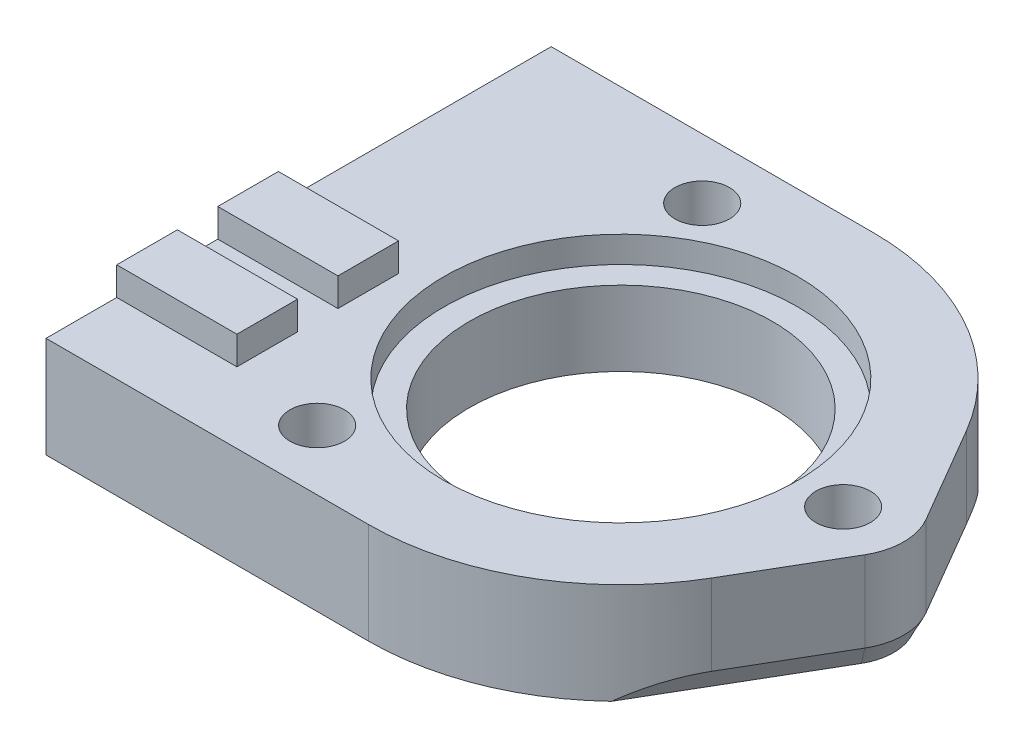
ISO-10303-21;
HEADER;
FILE_DESCRIPTION(('STEP AP214'),'2;1');
FILE_NAME('part.step','',(''),(''),'','','');
FILE_SCHEMA(('AUTOMOTIVE_DESIGN { 1 0 10303 214 1 1 1 1 }'));
ENDSEC;
DATA;
#1=APPLICATION_CONTEXT('core data for automotive mechanical design processes');
#2=APPLICATION_PROTOCOL_DEFINITION('international standard','automotive_design',2000,#1);
#3=PRODUCT_CONTEXT('',#1,'mechanical');
#4=PRODUCT('Part','Part','',(#3));
#5=PRODUCT_RELATED_PRODUCT_CATEGORY('part','',(#4));
#6=PRODUCT_DEFINITION_FORMATION('','',#4);
#7=PRODUCT_DEFINITION_CONTEXT('part definition',#1,'design');
#8=PRODUCT_DEFINITION('design','',#6,#7);
#9=PRODUCT_DEFINITION_SHAPE('','',#8);
#10=(LENGTH_UNIT() NAMED_UNIT(*) SI_UNIT(.MILLI.,.METRE.));
#11=(NAMED_UNIT(*) PLANE_ANGLE_UNIT() SI_UNIT($,.RADIAN.));
#12=(NAMED_UNIT(*) SI_UNIT($,.STERADIAN.) SOLID_ANGLE_UNIT());
#13=UNCERTAINTY_MEASURE_WITH_UNIT(LENGTH_MEASURE(1.E-05),#10,'distance_accuracy_value','');
#14=(GEOMETRIC_REPRESENTATION_CONTEXT(3) GLOBAL_UNCERTAINTY_ASSIGNED_CONTEXT((#13)) GLOBAL_UNIT_ASSIGNED_CONTEXT((#10,
#11,#12)) REPRESENTATION_CONTEXT('',''));
#15=CARTESIAN_POINT('',(0.,0.,0.));
#16=DIRECTION('',(0.,0.,1.));
#17=DIRECTION('',(1.,0.,0.));
#18=AXIS2_PLACEMENT_3D('',#15,#16,#17);
#19=CARTESIAN_POINT('',(-5.,6.4,9.));
#20=DIRECTION('',(0.,0.,-1.));
#21=DIRECTION('',(-1.,0.,0.));
#22=AXIS2_PLACEMENT_3D('',#19,#20,#21);
#23=PLANE('',#22);
#24=DIRECTION('',(0.,1.,0.));
#25=VECTOR('',#24,1.);
#26=CARTESIAN_POINT('',(29.0526284066724,6.4,9.));
#27=LINE('',#26,#25);
#28=CARTESIAN_POINT('',(29.0526284066724,5.,9.));
#29=VERTEX_POINT('',#28);
#30=CARTESIAN_POINT('',(29.0526284066724,6.4,9.));
#31=VERTEX_POINT('',#30);
#32=EDGE_CURVE('E56',#29,#31,#27,.T.);
#33=ORIENTED_EDGE('',*,*,#32,.F.);
#34=DIRECTION('',(1.,0.,0.));
#35=VECTOR('',#34,1.);
#36=CARTESIAN_POINT('',(-5.,5.,9.));
#37=LINE('',#36,#35);
#38=CARTESIAN_POINT('',(35.,5.,9.));
#39=VERTEX_POINT('',#38);
#40=EDGE_CURVE('E266',#29,#39,#37,.T.);
#41=ORIENTED_EDGE('',*,*,#40,.T.);
#42=DIRECTION('',(0.,-1.,0.));
#43=VECTOR('',#42,1.);
#44=CARTESIAN_POINT('',(35.,6.4,9.));
#45=LINE('',#44,#43);
#46=CARTESIAN_POINT('',(35.,6.4,9.));
#47=VERTEX_POINT('',#46);
#48=EDGE_CURVE('E275',#47,#39,#45,.T.);
#49=ORIENTED_EDGE('',*,*,#48,.F.);
#50=DIRECTION('',(1.,0.,0.));
#51=VECTOR('',#50,1.);
#52=CARTESIAN_POINT('',(-5.,6.4,9.));
#53=LINE('',#52,#51);
#54=EDGE_CURVE('E269',#31,#47,#53,.T.);
#55=ORIENTED_EDGE('',*,*,#54,.F.);
#56=EDGE_LOOP('',(#33,#41,#49,#55));
#57=FACE_BOUND('',#56,.T.);
#58=ADVANCED_FACE('F41',(#57),#23,.F.);
#59=CARTESIAN_POINT('',(-5.,6.4,1.));
#60=DIRECTION('',(0.,0.,1.));
#61=DIRECTION('',(1.,0.,0.));
#62=AXIS2_PLACEMENT_3D('',#59,#60,#61);
#63=PLANE('',#62);
#64=DIRECTION('',(0.,-1.,0.));
#65=VECTOR('',#64,1.);
#66=CARTESIAN_POINT('',(29.0526284066724,6.4,1.));
#67=LINE('',#66,#65);
#68=CARTESIAN_POINT('',(29.0526284066724,6.4,1.));
#69=VERTEX_POINT('',#68);
#70=CARTESIAN_POINT('',(29.0526284066724,5.,1.));
#71=VERTEX_POINT('',#70);
#72=EDGE_CURVE('E188',#69,#71,#67,.T.);
#73=ORIENTED_EDGE('',*,*,#72,.F.);
#74=DIRECTION('',(-1.,0.,0.));
#75=VECTOR('',#74,1.);
#76=CARTESIAN_POINT('',(-5.,6.4,1.));
#77=LINE('',#76,#75);
#78=CARTESIAN_POINT('',(35.,6.4,1.));
#79=VERTEX_POINT('',#78);
#80=EDGE_CURVE('E286',#79,#69,#77,.T.);
#81=ORIENTED_EDGE('',*,*,#80,.F.);
#82=DIRECTION('',(0.,-1.,0.));
#83=VECTOR('',#82,1.);
#84=CARTESIAN_POINT('',(35.,6.4,1.));
#85=LINE('',#84,#83);
#86=CARTESIAN_POINT('',(35.,5.,1.));
#87=VERTEX_POINT('',#86);
#88=EDGE_CURVE('E306',#79,#87,#85,.T.);
#89=ORIENTED_EDGE('',*,*,#88,.T.);
#90=DIRECTION('',(-1.,0.,0.));
#91=VECTOR('',#90,1.);
#92=CARTESIAN_POINT('',(-5.,5.,1.));
#93=LINE('',#92,#91);
#94=EDGE_CURVE('E298',#87,#71,#93,.T.);
#95=ORIENTED_EDGE('',*,*,#94,.T.);
#96=EDGE_LOOP('',(#73,#81,#89,#95));
#97=FACE_BOUND('',#96,.T.);
#98=ADVANCED_FACE('F423',(#97),#63,.F.);
#99=CARTESIAN_POINT('',(45.,5.,0.));
#100=DIRECTION('',(0.,1.,0.));
#101=DIRECTION('',(0.,0.,1.));
#102=AXIS2_PLACEMENT_3D('',#99,#100,#101);
#103=PLANE('',#102);
#104=CARTESIAN_POINT('',(56.,5.,0.));
#105=DIRECTION('',(0.,1.,0.));
#106=DIRECTION('',(0.,0.,1.));
#107=AXIS2_PLACEMENT_3D('',#104,#105,#106);
#108=CIRCLE('',#107,1.35);
#109=CARTESIAN_POINT('',(56.,5.,1.35));
#110=VERTEX_POINT('',#109);
#111=EDGE_CURVE('E310',#110,#110,#108,.T.);
#112=ORIENTED_EDGE('',*,*,#111,.F.);
#113=EDGE_LOOP('',(#112));
#114=FACE_BOUND('',#113,.T.);
#115=CARTESIAN_POINT('',(39.5,5.,9.52627944162882));
#116=DIRECTION('',(0.,1.,0.));
#117=DIRECTION('',(0.,0.,1.));
#118=AXIS2_PLACEMENT_3D('',#115,#116,#117);
#119=CIRCLE('',#118,1.35000000000001);
#120=CARTESIAN_POINT('',(39.5,5.,10.8762794416288));
#121=VERTEX_POINT('',#120);
#122=EDGE_CURVE('E319',#121,#121,#119,.T.);
#123=ORIENTED_EDGE('',*,*,#122,.F.);
#124=EDGE_LOOP('',(#123));
#125=FACE_BOUND('',#124,.T.);
#126=CARTESIAN_POINT('',(39.5,5.,-9.52627944162882));
#127=DIRECTION('',(0.,1.,0.));
#128=DIRECTION('',(0.,0.,1.));
#129=AXIS2_PLACEMENT_3D('',#126,#127,#128);
#130=CIRCLE('',#129,1.35000000000001);
#131=CARTESIAN_POINT('',(39.5,5.,-8.17627944162881));
#132=VERTEX_POINT('',#131);
#133=EDGE_CURVE('E309',#132,#132,#130,.T.);
#134=ORIENTED_EDGE('',*,*,#133,.F.);
#135=EDGE_LOOP('',(#134));
#136=FACE_BOUND('',#135,.T.);
#137=CARTESIAN_POINT('',(45.,5.,0.));
#138=DIRECTION('',(0.,1.,0.));
#139=DIRECTION('',(0.,0.,1.));
#140=AXIS2_PLACEMENT_3D('',#137,#138,#139);
#141=CIRCLE('',#140,8.75);
#142=CARTESIAN_POINT('',(45.,5.,8.75));
#143=VERTEX_POINT('',#142);
#144=EDGE_CURVE('E318',#143,#143,#141,.T.);
#145=ORIENTED_EDGE('',*,*,#144,.F.);
#146=EDGE_LOOP('',(#145));
#147=FACE_BOUND('',#146,.T.);
#148=DIRECTION('',(-1.,0.,0.));
#149=VECTOR('',#148,1.);
#150=CARTESIAN_POINT('',(45.,5.,-12.5));
#151=LINE('',#150,#149);
#152=CARTESIAN_POINT('',(45.,5.,-12.5));
#153=VERTEX_POINT('',#152);
#154=CARTESIAN_POINT('',(29.0526284066724,5.,-12.5));
#155=VERTEX_POINT('',#154);
#156=EDGE_CURVE('E370',#153,#155,#151,.T.);
#157=ORIENTED_EDGE('',*,*,#156,.T.);
#158=DIRECTION('',(0.,0.,1.));
#159=VECTOR('',#158,1.);
#160=CARTESIAN_POINT('',(29.0526284066724,5.,0.));
#161=LINE('',#160,#159);
#162=EDGE_CURVE('E394',#155,#71,#161,.T.);
#163=ORIENTED_EDGE('',*,*,#162,.T.);
#164=ORIENTED_EDGE('',*,*,#94,.F.);
#165=DIRECTION('',(0.,0.,-1.));
#166=VECTOR('',#165,1.);
#167=CARTESIAN_POINT('',(35.,5.,4.));
#168=LINE('',#167,#166);
#169=CARTESIAN_POINT('',(35.,5.,4.));
#170=VERTEX_POINT('',#169);
#171=EDGE_CURVE('E281',#170,#87,#168,.T.);
#172=ORIENTED_EDGE('',*,*,#171,.F.);
#173=DIRECTION('',(1.,0.,0.));
#174=VECTOR('',#173,1.);
#175=CARTESIAN_POINT('',(-5.,5.,4.));
#176=LINE('',#175,#174);
#177=CARTESIAN_POINT('',(29.0526284066724,5.,4.));
#178=VERTEX_POINT('',#177);
#179=EDGE_CURVE('E287',#178,#170,#176,.T.);
#180=ORIENTED_EDGE('',*,*,#179,.F.);
#181=CARTESIAN_POINT('',(29.0526284066724,5.,6.));
#182=VERTEX_POINT('',#181);
#183=EDGE_CURVE('E719',#178,#182,#161,.T.);
#184=ORIENTED_EDGE('',*,*,#183,.T.);
#185=DIRECTION('',(-1.,0.,0.));
#186=VECTOR('',#185,1.);
#187=CARTESIAN_POINT('',(-5.,5.,6.));
#188=LINE('',#187,#186);
#189=CARTESIAN_POINT('',(35.,5.,6.));
#190=VERTEX_POINT('',#189);
#191=EDGE_CURVE('E256',#190,#182,#188,.T.);
#192=ORIENTED_EDGE('',*,*,#191,.F.);
#193=DIRECTION('',(0.,0.,-1.));
#194=VECTOR('',#193,1.);
#195=CARTESIAN_POINT('',(35.,5.,9.));
#196=LINE('',#195,#194);
#197=EDGE_CURVE('E247',#39,#190,#196,.T.);
#198=ORIENTED_EDGE('',*,*,#197,.F.);
#199=ORIENTED_EDGE('',*,*,#40,.F.);
#200=CARTESIAN_POINT('',(29.0526284066724,5.,12.5));
#201=VERTEX_POINT('',#200);
#202=EDGE_CURVE('E713',#29,#201,#161,.T.);
#203=ORIENTED_EDGE('',*,*,#202,.T.);
#204=DIRECTION('',(1.,0.,0.));
#205=VECTOR('',#204,1.);
#206=CARTESIAN_POINT('',(45.,5.,12.5));
#207=LINE('',#206,#205);
#208=CARTESIAN_POINT('',(45.,5.,12.5));
#209=VERTEX_POINT('',#208);
#210=EDGE_CURVE('E186',#201,#209,#207,.T.);
#211=ORIENTED_EDGE('',*,*,#210,.T.);
#212=CARTESIAN_POINT('',(45.,5.,0.));
#213=DIRECTION('',(0.,1.,0.));
#214=DIRECTION('',(0.,0.,1.));
#215=AXIS2_PLACEMENT_3D('',#212,#213,#214);
#216=CIRCLE('',#215,12.5);
#217=CARTESIAN_POINT('',(55.7954545454545,5.,6.30144119682353));
#218=VERTEX_POINT('',#217);
#219=EDGE_CURVE('E201',#209,#218,#216,.T.);
#220=ORIENTED_EDGE('',*,*,#219,.T.);
#221=DIRECTION('',(0.504115295745884,0.,-0.863636363636363));
#222=VECTOR('',#221,1.);
#223=CARTESIAN_POINT('',(55.7954545454545,5.,6.30144119682353));
#224=LINE('',#223,#222);
#225=CARTESIAN_POINT('',(58.5909090909091,5.,1.51234588723765));
#226=VERTEX_POINT('',#225);
#227=EDGE_CURVE('E351',#218,#226,#224,.T.);
#228=ORIENTED_EDGE('',*,*,#227,.T.);
#229=CARTESIAN_POINT('',(56.0000000000001,5.,0.));
#230=DIRECTION('',(0.,1.,0.));
#231=DIRECTION('',(0.,0.,1.));
#232=AXIS2_PLACEMENT_3D('',#229,#230,#231);
#233=CIRCLE('',#232,2.99999999999995);
#234=CARTESIAN_POINT('',(58.5909090909091,5.,-1.51234588723765));
#235=VERTEX_POINT('',#234);
#236=EDGE_CURVE('E347',#226,#235,#233,.T.);
#237=ORIENTED_EDGE('',*,*,#236,.T.);
#238=DIRECTION('',(-0.504115295745884,0.,-0.863636363636363));
#239=VECTOR('',#238,1.);
#240=CARTESIAN_POINT('',(58.5909090909091,5.,-1.51234588723765));
#241=LINE('',#240,#239);
#242=CARTESIAN_POINT('',(55.7954545454545,5.,-6.30144119682353));
#243=VERTEX_POINT('',#242);
#244=EDGE_CURVE('E343',#235,#243,#241,.T.);
#245=ORIENTED_EDGE('',*,*,#244,.T.);
#246=EDGE_CURVE('E196',#243,#153,#216,.T.);
#247=ORIENTED_EDGE('',*,*,#246,.T.);
#248=EDGE_LOOP('',(#157,#163,#164,#172,#180,#184,#192,#198,#199,#203,#211,#220,#228,#237,#245,#247));
#249=FACE_BOUND('',#248,.T.);
#250=ADVANCED_FACE('F392',(#114,#125,#136,#147,#249),#103,.T.);
#251=CARTESIAN_POINT('',(45.,5.,-12.5));
#252=DIRECTION('',(0.,0.,1.));
#253=DIRECTION('',(1.,0.,0.));
#254=AXIS2_PLACEMENT_3D('',#251,#252,#253);
#255=PLANE('',#254);
#256=DIRECTION('',(0.,-1.,0.));
#257=VECTOR('',#256,1.);
#258=CARTESIAN_POINT('',(29.0526284066724,5.,-12.5));
#259=LINE('',#258,#257);
#260=CARTESIAN_POINT('',(29.0526284066724,0.,-12.5));
#261=VERTEX_POINT('',#260);
#262=EDGE_CURVE('E172',#155,#261,#259,.T.);
#263=ORIENTED_EDGE('',*,*,#262,.F.);
#264=ORIENTED_EDGE('',*,*,#156,.F.);
#265=DIRECTION('',(0.,-1.,0.));
#266=VECTOR('',#265,1.);
#267=CARTESIAN_POINT('',(45.,5.,-12.5));
#268=LINE('',#267,#266);
#269=CARTESIAN_POINT('',(45.,0.,-12.5));
#270=VERTEX_POINT('',#269);
#271=EDGE_CURVE('E210',#153,#270,#268,.T.);
#272=ORIENTED_EDGE('',*,*,#271,.T.);
#273=DIRECTION('',(-1.,0.,0.));
#274=VECTOR('',#273,1.);
#275=CARTESIAN_POINT('',(45.,0.,-12.5));
#276=LINE('',#275,#274);
#277=EDGE_CURVE('E197',#270,#261,#276,.T.);
#278=ORIENTED_EDGE('',*,*,#277,.T.);
#279=EDGE_LOOP('',(#263,#264,#272,#278));
#280=FACE_BOUND('',#279,.T.);
#281=ADVANCED_FACE('F389',(#280),#255,.F.);
#282=CARTESIAN_POINT('',(45.,5.,12.5));
#283=DIRECTION('',(0.,0.,-1.));
#284=DIRECTION('',(-1.,0.,0.));
#285=AXIS2_PLACEMENT_3D('',#282,#283,#284);
#286=PLANE('',#285);
#287=DIRECTION('',(0.,1.,0.));
#288=VECTOR('',#287,1.);
#289=CARTESIAN_POINT('',(29.0526284066724,5.,12.5));
#290=LINE('',#289,#288);
#291=CARTESIAN_POINT('',(29.0526284066724,0.,12.5));
#292=VERTEX_POINT('',#291);
#293=EDGE_CURVE('E169',#292,#201,#290,.T.);
#294=ORIENTED_EDGE('',*,*,#293,.F.);
#295=DIRECTION('',(1.,0.,0.));
#296=VECTOR('',#295,1.);
#297=CARTESIAN_POINT('',(45.,0.,12.5));
#298=LINE('',#297,#296);
#299=CARTESIAN_POINT('',(45.,0.,12.5));
#300=VERTEX_POINT('',#299);
#301=EDGE_CURVE('E184',#292,#300,#298,.T.);
#302=ORIENTED_EDGE('',*,*,#301,.T.);
#303=DIRECTION('',(0.,-1.,0.));
#304=VECTOR('',#303,1.);
#305=CARTESIAN_POINT('',(45.,5.,12.5));
#306=LINE('',#305,#304);
#307=EDGE_CURVE('E207',#209,#300,#306,.T.);
#308=ORIENTED_EDGE('',*,*,#307,.F.);
#309=ORIENTED_EDGE('',*,*,#210,.F.);
#310=EDGE_LOOP('',(#294,#302,#308,#309));
#311=FACE_BOUND('',#310,.T.);
#312=ADVANCED_FACE('F182',(#311),#286,.F.);
#313=CARTESIAN_POINT('',(45.,0.,0.));
#314=DIRECTION('',(0.,1.,0.));
#315=DIRECTION('',(0.,0.,1.));
#316=AXIS2_PLACEMENT_3D('',#313,#314,#315);
#317=PLANE('',#316);
#318=CARTESIAN_POINT('',(45.,0.,0.));
#319=DIRECTION('',(0.,1.,0.));
#320=DIRECTION('',(0.,0.,1.));
#321=AXIS2_PLACEMENT_3D('',#318,#319,#320);
#322=CIRCLE('',#321,7.5);
#323=CARTESIAN_POINT('',(45.,0.,7.5));
#324=VERTEX_POINT('',#323);
#325=EDGE_CURVE('E219',#324,#324,#322,.F.);
#326=ORIENTED_EDGE('',*,*,#325,.F.);
#327=EDGE_LOOP('',(#326));
#328=FACE_BOUND('',#327,.T.);
#329=CARTESIAN_POINT('',(39.5,0.,-9.52627944162882));
#330=DIRECTION('',(0.,1.,0.));
#331=DIRECTION('',(0.,0.,1.));
#332=AXIS2_PLACEMENT_3D('',#329,#330,#331);
#333=CIRCLE('',#332,1.35000000000001);
#334=CARTESIAN_POINT('',(39.5,0.,-8.17627944162881));
#335=VERTEX_POINT('',#334);
#336=EDGE_CURVE('E323',#335,#335,#333,.F.);
#337=ORIENTED_EDGE('',*,*,#336,.F.);
#338=EDGE_LOOP('',(#337));
#339=FACE_BOUND('',#338,.T.);
#340=CARTESIAN_POINT('',(39.5,0.,9.52627944162882));
#341=DIRECTION('',(0.,1.,0.));
#342=DIRECTION('',(0.,0.,1.));
#343=AXIS2_PLACEMENT_3D('',#340,#341,#342);
#344=CIRCLE('',#343,1.35000000000001);
#345=CARTESIAN_POINT('',(39.5,0.,10.8762794416288));
#346=VERTEX_POINT('',#345);
#347=EDGE_CURVE('E314',#346,#346,#344,.F.);
#348=ORIENTED_EDGE('',*,*,#347,.F.);
#349=EDGE_LOOP('',(#348));
#350=FACE_BOUND('',#349,.T.);
#351=CARTESIAN_POINT('',(56.,0.,0.));
#352=DIRECTION('',(0.,1.,0.));
#353=DIRECTION('',(0.,0.,1.));
#354=AXIS2_PLACEMENT_3D('',#351,#352,#353);
#355=CIRCLE('',#354,1.35);
#356=CARTESIAN_POINT('',(56.,0.,1.35));
#357=VERTEX_POINT('',#356);
#358=EDGE_CURVE('E313',#357,#357,#355,.F.);
#359=ORIENTED_EDGE('',*,*,#358,.F.);
#360=EDGE_LOOP('',(#359));
#361=FACE_BOUND('',#360,.T.);
#362=DIRECTION('',(0.,0.,-1.));
#363=VECTOR('',#362,1.);
#364=CARTESIAN_POINT('',(29.0526284066724,0.,20.6622725443589));
#365=LINE('',#364,#363);
#366=EDGE_CURVE('E166',#292,#261,#365,.T.);
#367=ORIENTED_EDGE('',*,*,#366,.T.);
#368=ORIENTED_EDGE('',*,*,#277,.F.);
#369=CARTESIAN_POINT('',(45.,0.,0.));
#370=DIRECTION('',(0.,1.,0.));
#371=DIRECTION('',(0.,0.,1.));
#372=AXIS2_PLACEMENT_3D('',#369,#370,#371);
#373=CIRCLE('',#372,12.5);
#374=CARTESIAN_POINT('',(53.5992328285258,0.,-9.07211082167782));
#375=VERTEX_POINT('',#374);
#376=EDGE_CURVE('E346',#375,#270,#373,.T.);
#377=ORIENTED_EDGE('',*,*,#376,.F.);
#378=DIRECTION('',(0.504115295745884,0.,0.863636363636363));
#379=VECTOR('',#378,1.);
#380=CARTESIAN_POINT('',(55.3636363636364,0.,-6.04938354895061));
#381=LINE('',#380,#379);
#382=CARTESIAN_POINT('',(58.1590909090909,0.,-1.26028823936472));
#383=VERTEX_POINT('',#382);
#384=EDGE_CURVE('E226',#375,#383,#381,.T.);
#385=ORIENTED_EDGE('',*,*,#384,.T.);
#386=CARTESIAN_POINT('',(56.0000000000001,0.,0.));
#387=DIRECTION('',(0.,1.,0.));
#388=DIRECTION('',(0.,0.,1.));
#389=AXIS2_PLACEMENT_3D('',#386,#387,#388);
#390=CIRCLE('',#389,2.49999999999997);
#391=CARTESIAN_POINT('',(58.1590909090909,0.,1.26028823936472));
#392=VERTEX_POINT('',#391);
#393=EDGE_CURVE('E223',#383,#392,#390,.F.);
#394=ORIENTED_EDGE('',*,*,#393,.T.);
#395=DIRECTION('',(-0.504115295745884,0.,0.863636363636363));
#396=VECTOR('',#395,1.);
#397=CARTESIAN_POINT('',(55.3636363636364,0.,6.04938354895061));
#398=LINE('',#397,#396);
#399=CARTESIAN_POINT('',(53.5992328285258,0.,9.07211082167782));
#400=VERTEX_POINT('',#399);
#401=EDGE_CURVE('E229',#392,#400,#398,.T.);
#402=ORIENTED_EDGE('',*,*,#401,.T.);
#403=EDGE_CURVE('E194',#300,#400,#373,.T.);
#404=ORIENTED_EDGE('',*,*,#403,.F.);
#405=ORIENTED_EDGE('',*,*,#301,.F.);
#406=EDGE_LOOP('',(#367,#368,#377,#385,#394,#402,#404,#405));
#407=FACE_BOUND('',#406,.T.);
#408=ADVANCED_FACE('F192',(#328,#339,#350,#361,#407),#317,.F.);
#409=CARTESIAN_POINT('',(-5.,6.4,4.));
#410=DIRECTION('',(0.,0.,-1.));
#411=DIRECTION('',(-1.,0.,0.));
#412=AXIS2_PLACEMENT_3D('',#409,#410,#411);
#413=PLANE('',#412);
#414=DIRECTION('',(0.,1.,0.));
#415=VECTOR('',#414,1.);
#416=CARTESIAN_POINT('',(29.0526284066724,6.4,4.));
#417=LINE('',#416,#415);
#418=CARTESIAN_POINT('',(29.0526284066724,6.4,4.));
#419=VERTEX_POINT('',#418);
#420=EDGE_CURVE('E714',#178,#419,#417,.T.);
#421=ORIENTED_EDGE('',*,*,#420,.F.);
#422=ORIENTED_EDGE('',*,*,#179,.T.);
#423=DIRECTION('',(0.,-1.,0.));
#424=VECTOR('',#423,1.);
#425=CARTESIAN_POINT('',(35.,6.4,4.));
#426=LINE('',#425,#424);
#427=CARTESIAN_POINT('',(35.,6.4,4.));
#428=VERTEX_POINT('',#427);
#429=EDGE_CURVE('E294',#428,#170,#426,.T.);
#430=ORIENTED_EDGE('',*,*,#429,.F.);
#431=DIRECTION('',(1.,0.,0.));
#432=VECTOR('',#431,1.);
#433=CARTESIAN_POINT('',(-5.,6.4,4.));
#434=LINE('',#433,#432);
#435=EDGE_CURVE('E291',#419,#428,#434,.T.);
#436=ORIENTED_EDGE('',*,*,#435,.F.);
#437=EDGE_LOOP('',(#421,#422,#430,#436));
#438=FACE_BOUND('',#437,.T.);
#439=ADVANCED_FACE('F446',(#438),#413,.F.);
#440=CARTESIAN_POINT('',(0.,6.4,0.));
#441=DIRECTION('',(0.,-1.,0.));
#442=DIRECTION('',(0.,0.,-1.));
#443=AXIS2_PLACEMENT_3D('',#440,#441,#442);
#444=PLANE('',#443);
#445=DIRECTION('',(0.,0.,-1.));
#446=VECTOR('',#445,1.);
#447=CARTESIAN_POINT('',(29.0526284066724,6.4,0.));
#448=LINE('',#447,#446);
#449=EDGE_CURVE('E189',#419,#69,#448,.T.);
#450=ORIENTED_EDGE('',*,*,#449,.F.);
#451=ORIENTED_EDGE('',*,*,#435,.T.);
#452=DIRECTION('',(0.,0.,-1.));
#453=VECTOR('',#452,1.);
#454=CARTESIAN_POINT('',(35.,6.4,4.));
#455=LINE('',#454,#453);
#456=EDGE_CURVE('E282',#428,#79,#455,.T.);
#457=ORIENTED_EDGE('',*,*,#456,.T.);
#458=ORIENTED_EDGE('',*,*,#80,.T.);
#459=EDGE_LOOP('',(#450,#451,#457,#458));
#460=FACE_BOUND('',#459,.T.);
#461=ADVANCED_FACE('F438',(#460),#444,.F.);
#462=CARTESIAN_POINT('',(-5.,6.4,6.));
#463=DIRECTION('',(0.,0.,1.));
#464=DIRECTION('',(1.,0.,0.));
#465=AXIS2_PLACEMENT_3D('',#462,#463,#464);
#466=PLANE('',#465);
#467=DIRECTION('',(0.,-1.,0.));
#468=VECTOR('',#467,1.);
#469=CARTESIAN_POINT('',(29.0526284066724,6.4,6.));
#470=LINE('',#469,#468);
#471=CARTESIAN_POINT('',(29.0526284066724,6.4,6.));
#472=VERTEX_POINT('',#471);
#473=EDGE_CURVE('E178',#472,#182,#470,.T.);
#474=ORIENTED_EDGE('',*,*,#473,.F.);
#475=DIRECTION('',(-1.,0.,0.));
#476=VECTOR('',#475,1.);
#477=CARTESIAN_POINT('',(-5.,6.4,6.));
#478=LINE('',#477,#476);
#479=CARTESIAN_POINT('',(35.,6.4,6.));
#480=VERTEX_POINT('',#479);
#481=EDGE_CURVE('E699',#480,#472,#478,.T.);
#482=ORIENTED_EDGE('',*,*,#481,.F.);
#483=DIRECTION('',(0.,-1.,0.));
#484=VECTOR('',#483,1.);
#485=CARTESIAN_POINT('',(35.,6.4,6.));
#486=LINE('',#485,#484);
#487=EDGE_CURVE('E278',#480,#190,#486,.T.);
#488=ORIENTED_EDGE('',*,*,#487,.T.);
#489=ORIENTED_EDGE('',*,*,#191,.T.);
#490=EDGE_LOOP('',(#474,#482,#488,#489));
#491=FACE_BOUND('',#490,.T.);
#492=ADVANCED_FACE('F435',(#491),#466,.F.);
#493=CARTESIAN_POINT('',(0.,6.4,0.));
#494=DIRECTION('',(0.,-1.,0.));
#495=DIRECTION('',(0.,0.,-1.));
#496=AXIS2_PLACEMENT_3D('',#493,#494,#495);
#497=PLANE('',#496);
#498=DIRECTION('',(0.,0.,-1.));
#499=VECTOR('',#498,1.);
#500=CARTESIAN_POINT('',(29.0526284066724,6.4,0.));
#501=LINE('',#500,#499);
#502=EDGE_CURVE('E11',#31,#472,#501,.T.);
#503=ORIENTED_EDGE('',*,*,#502,.F.);
#504=ORIENTED_EDGE('',*,*,#54,.T.);
#505=DIRECTION('',(0.,0.,-1.));
#506=VECTOR('',#505,1.);
#507=CARTESIAN_POINT('',(35.,6.4,9.));
#508=LINE('',#507,#506);
#509=EDGE_CURVE('E274',#47,#480,#508,.T.);
#510=ORIENTED_EDGE('',*,*,#509,.T.);
#511=ORIENTED_EDGE('',*,*,#481,.T.);
#512=EDGE_LOOP('',(#503,#504,#510,#511));
#513=FACE_BOUND('',#512,.T.);
#514=ADVANCED_FACE('F433',(#513),#497,.F.);
#515=CARTESIAN_POINT('',(45.,-0.00100000000000013,0.));
#516=DIRECTION('',(0.,1.,0.));
#517=DIRECTION('',(0.,0.,1.));
#518=AXIS2_PLACEMENT_3D('',#515,#516,#517);
#519=CYLINDRICAL_SURFACE('',#518,7.5);
#520=ORIENTED_EDGE('',*,*,#325,.T.);
#521=EDGE_LOOP('',(#520));
#522=FACE_BOUND('',#521,.T.);
#523=CARTESIAN_POINT('',(45.,3.7,0.));
#524=DIRECTION('',(0.,1.,0.));
#525=DIRECTION('',(0.,0.,1.));
#526=AXIS2_PLACEMENT_3D('',#523,#524,#525);
#527=CIRCLE('',#526,7.5);
#528=CARTESIAN_POINT('',(45.,3.7,7.5));
#529=VERTEX_POINT('',#528);
#530=EDGE_CURVE('E215',#529,#529,#527,.F.);
#531=ORIENTED_EDGE('',*,*,#530,.F.);
#532=EDGE_LOOP('',(#531));
#533=FACE_BOUND('',#532,.T.);
#534=ADVANCED_FACE('F419',(#522,#533),#519,.F.);
#535=CARTESIAN_POINT('',(45.,5.,0.));
#536=DIRECTION('',(0.,-1.,0.));
#537=DIRECTION('',(0.,0.,-1.));
#538=AXIS2_PLACEMENT_3D('',#535,#536,#537);
#539=CYLINDRICAL_SURFACE('',#538,12.5);
#540=DIRECTION('',(0.,-1.,0.));
#541=VECTOR('',#540,1.);
#542=CARTESIAN_POINT('',(55.7954545454545,18.0039131109965,-6.30144119682353));
#543=LINE('',#542,#541);
#544=CARTESIAN_POINT('',(55.7954545454545,0.999999999999952,-6.30144119682353));
#545=VERTEX_POINT('',#544);
#546=EDGE_CURVE('E359',#243,#545,#543,.T.);
#547=ORIENTED_EDGE('',*,*,#546,.T.);
#548=CARTESIAN_POINT('',(45.,-23.9999999999998,0.));
#549=DIRECTION('',(-0.772459846772653,0.447213595499961,0.450894427914082));
#550=DIRECTION('',(-0.38622992338633,-0.894427190999914,0.225447213957043));
#551=AXIS2_PLACEMENT_3D('',#548,#549,#550);
#552=ELLIPSE('',#551,27.9508497187471,12.5);
#553=EDGE_CURVE('E237',#545,#375,#552,.T.);
#554=ORIENTED_EDGE('',*,*,#553,.T.);
#555=ORIENTED_EDGE('',*,*,#376,.T.);
#556=ORIENTED_EDGE('',*,*,#271,.F.);
#557=ORIENTED_EDGE('',*,*,#246,.F.);
#558=EDGE_LOOP('',(#547,#554,#555,#556,#557));
#559=FACE_BOUND('',#558,.T.);
#560=ADVANCED_FACE('F383',(#559),#539,.T.);
#561=ORIENTED_EDGE('',*,*,#403,.T.);
#562=CARTESIAN_POINT('',(45.,-23.9999999999998,0.));
#563=DIRECTION('',(-0.772459846772653,0.447213595499962,-0.450894427914082));
#564=DIRECTION('',(-0.38622992338633,-0.894427190999914,-0.225447213957043));
#565=AXIS2_PLACEMENT_3D('',#562,#563,#564);
#566=ELLIPSE('',#565,27.9508497187471,12.5);
#567=CARTESIAN_POINT('',(55.7954545454545,0.999999999999952,6.30144119682353));
#568=VERTEX_POINT('',#567);
#569=EDGE_CURVE('E232',#400,#568,#566,.T.);
#570=ORIENTED_EDGE('',*,*,#569,.T.);
#571=DIRECTION('',(0.,-1.,0.));
#572=VECTOR('',#571,1.);
#573=CARTESIAN_POINT('',(55.7954545454545,18.0039131109965,6.30144119682353));
#574=LINE('',#573,#572);
#575=EDGE_CURVE('E355',#218,#568,#574,.T.);
#576=ORIENTED_EDGE('',*,*,#575,.F.);
#577=ORIENTED_EDGE('',*,*,#219,.F.);
#578=ORIENTED_EDGE('',*,*,#307,.T.);
#579=EDGE_LOOP('',(#561,#570,#576,#577,#578));
#580=FACE_BOUND('',#579,.T.);
#581=ADVANCED_FACE('F410',(#580),#539,.T.);
#582=CARTESIAN_POINT('',(56.0000000000001,18.0039131109965,0.));
#583=DIRECTION('',(0.,-1.,0.));
#584=DIRECTION('',(0.,0.,-1.));
#585=AXIS2_PLACEMENT_3D('',#582,#583,#584);
#586=CYLINDRICAL_SURFACE('',#585,2.99999999999995);
#587=DIRECTION('',(0.,-1.,0.));
#588=VECTOR('',#587,1.);
#589=CARTESIAN_POINT('',(58.5909090909091,18.0039131109965,1.51234588723765));
#590=LINE('',#589,#588);
#591=CARTESIAN_POINT('',(58.5909090909091,0.999999999999952,1.51234588723765));
#592=VERTEX_POINT('',#591);
#593=EDGE_CURVE('E342',#226,#592,#590,.T.);
#594=ORIENTED_EDGE('',*,*,#593,.T.);
#595=CARTESIAN_POINT('',(56.0000000000001,0.999999999999952,0.));
#596=DIRECTION('',(0.,1.,0.));
#597=DIRECTION('',(0.,0.,1.));
#598=AXIS2_PLACEMENT_3D('',#595,#596,#597);
#599=CIRCLE('',#598,2.99999999999995);
#600=CARTESIAN_POINT('',(58.5909090909091,0.999999999999952,-1.51234588723765));
#601=VERTEX_POINT('',#600);
#602=EDGE_CURVE('E50',#592,#601,#599,.T.);
#603=ORIENTED_EDGE('',*,*,#602,.T.);
#604=DIRECTION('',(0.,-1.,0.));
#605=VECTOR('',#604,1.);
#606=CARTESIAN_POINT('',(58.5909090909091,18.0039131109965,-1.51234588723765));
#607=LINE('',#606,#605);
#608=EDGE_CURVE('E356',#235,#601,#607,.T.);
#609=ORIENTED_EDGE('',*,*,#608,.F.);
#610=ORIENTED_EDGE('',*,*,#236,.F.);
#611=EDGE_LOOP('',(#594,#603,#609,#610));
#612=FACE_BOUND('',#611,.T.);
#613=ADVANCED_FACE('F408',(#612),#586,.T.);
#614=CARTESIAN_POINT('',(58.5909090909091,18.0039131109965,-1.51234588723765));
#615=DIRECTION('',(-0.863636363636363,0.,0.504115295745884));
#616=DIRECTION('',(0.504115295745884,0.,0.863636363636363));
#617=AXIS2_PLACEMENT_3D('',#614,#615,#616);
#618=PLANE('',#617);
#619=ORIENTED_EDGE('',*,*,#608,.T.);
#620=DIRECTION('',(-0.504115295745884,0.,-0.863636363636363));
#621=VECTOR('',#620,1.);
#622=CARTESIAN_POINT('',(58.5909090909091,0.999999999999952,-1.51234588723765));
#623=LINE('',#622,#621);
#624=EDGE_CURVE('E64',#601,#545,#623,.T.);
#625=ORIENTED_EDGE('',*,*,#624,.T.);
#626=ORIENTED_EDGE('',*,*,#546,.F.);
#627=ORIENTED_EDGE('',*,*,#244,.F.);
#628=EDGE_LOOP('',(#619,#625,#626,#627));
#629=FACE_BOUND('',#628,.T.);
#630=ADVANCED_FACE('F417',(#629),#618,.F.);
#631=CARTESIAN_POINT('',(55.7954545454545,18.0039131109965,6.30144119682353));
#632=DIRECTION('',(-0.863636363636363,0.,-0.504115295745884));
#633=DIRECTION('',(-0.504115295745884,0.,0.863636363636363));
#634=AXIS2_PLACEMENT_3D('',#631,#632,#633);
#635=PLANE('',#634);
#636=ORIENTED_EDGE('',*,*,#575,.T.);
#637=DIRECTION('',(0.504115295745884,0.,-0.863636363636363));
#638=VECTOR('',#637,1.);
#639=CARTESIAN_POINT('',(55.7954545454545,0.999999999999952,6.30144119682353));
#640=LINE('',#639,#638);
#641=EDGE_CURVE('E214',#568,#592,#640,.T.);
#642=ORIENTED_EDGE('',*,*,#641,.T.);
#643=ORIENTED_EDGE('',*,*,#593,.F.);
#644=ORIENTED_EDGE('',*,*,#227,.F.);
#645=EDGE_LOOP('',(#636,#642,#643,#644));
#646=FACE_BOUND('',#645,.T.);
#647=ADVANCED_FACE('F405',(#646),#635,.F.);
#648=CARTESIAN_POINT('',(45.,3.7,0.));
#649=DIRECTION('',(0.,1.,0.));
#650=DIRECTION('',(0.,0.,1.));
#651=AXIS2_PLACEMENT_3D('',#648,#649,#650);
#652=PLANE('',#651);
#653=CARTESIAN_POINT('',(45.,3.7,0.));
#654=DIRECTION('',(0.,1.,0.));
#655=DIRECTION('',(0.,0.,1.));
#656=AXIS2_PLACEMENT_3D('',#653,#654,#655);
#657=CIRCLE('',#656,8.75);
#658=CARTESIAN_POINT('',(45.,3.7,8.75));
#659=VERTEX_POINT('',#658);
#660=EDGE_CURVE('E220',#659,#659,#657,.T.);
#661=ORIENTED_EDGE('',*,*,#660,.T.);
#662=EDGE_LOOP('',(#661));
#663=FACE_BOUND('',#662,.T.);
#664=ORIENTED_EDGE('',*,*,#530,.T.);
#665=EDGE_LOOP('',(#664));
#666=FACE_BOUND('',#665,.T.);
#667=ADVANCED_FACE('F467',(#663,#666),#652,.T.);
#668=CARTESIAN_POINT('',(45.,3.7,0.));
#669=DIRECTION('',(0.,1.,0.));
#670=DIRECTION('',(0.,0.,1.));
#671=AXIS2_PLACEMENT_3D('',#668,#669,#670);
#672=CYLINDRICAL_SURFACE('',#671,8.75);
#673=ORIENTED_EDGE('',*,*,#660,.F.);
#674=EDGE_LOOP('',(#673));
#675=FACE_BOUND('',#674,.T.);
#676=ORIENTED_EDGE('',*,*,#144,.T.);
#677=EDGE_LOOP('',(#676));
#678=FACE_BOUND('',#677,.T.);
#679=ADVANCED_FACE('F465',(#675,#678),#672,.F.);
#680=CARTESIAN_POINT('',(39.5,-0.00100000000000013,-9.52627944162882));
#681=DIRECTION('',(0.,1.,0.));
#682=DIRECTION('',(0.,0.,1.));
#683=AXIS2_PLACEMENT_3D('',#680,#681,#682);
#684=CYLINDRICAL_SURFACE('',#683,1.35000000000001);
#685=ORIENTED_EDGE('',*,*,#133,.T.);
#686=EDGE_LOOP('',(#685));
#687=FACE_BOUND('',#686,.T.);
#688=ORIENTED_EDGE('',*,*,#336,.T.);
#689=EDGE_LOOP('',(#688));
#690=FACE_BOUND('',#689,.T.);
#691=ADVANCED_FACE('F461',(#687,#690),#684,.F.);
#692=CARTESIAN_POINT('',(39.5,-0.00100000000000013,9.52627944162882));
#693=DIRECTION('',(0.,1.,0.));
#694=DIRECTION('',(0.,0.,1.));
#695=AXIS2_PLACEMENT_3D('',#692,#693,#694);
#696=CYLINDRICAL_SURFACE('',#695,1.35000000000001);
#697=ORIENTED_EDGE('',*,*,#122,.T.);
#698=EDGE_LOOP('',(#697));
#699=FACE_BOUND('',#698,.T.);
#700=ORIENTED_EDGE('',*,*,#347,.T.);
#701=EDGE_LOOP('',(#700));
#702=FACE_BOUND('',#701,.T.);
#703=ADVANCED_FACE('F457',(#699,#702),#696,.F.);
#704=CARTESIAN_POINT('',(56.,-0.00100000000000013,0.));
#705=DIRECTION('',(0.,1.,0.));
#706=DIRECTION('',(0.,0.,1.));
#707=AXIS2_PLACEMENT_3D('',#704,#705,#706);
#708=CYLINDRICAL_SURFACE('',#707,1.35);
#709=ORIENTED_EDGE('',*,*,#111,.T.);
#710=EDGE_LOOP('',(#709));
#711=FACE_BOUND('',#710,.T.);
#712=ORIENTED_EDGE('',*,*,#358,.T.);
#713=EDGE_LOOP('',(#712));
#714=FACE_BOUND('',#713,.T.);
#715=ADVANCED_FACE('F453',(#711,#714),#708,.F.);
#716=CARTESIAN_POINT('',(35.,6.4,4.));
#717=DIRECTION('',(-1.,0.,0.));
#718=DIRECTION('',(0.,0.,1.));
#719=AXIS2_PLACEMENT_3D('',#716,#717,#718);
#720=PLANE('',#719);
#721=ORIENTED_EDGE('',*,*,#171,.T.);
#722=ORIENTED_EDGE('',*,*,#88,.F.);
#723=ORIENTED_EDGE('',*,*,#456,.F.);
#724=ORIENTED_EDGE('',*,*,#429,.T.);
#725=EDGE_LOOP('',(#721,#722,#723,#724));
#726=FACE_BOUND('',#725,.T.);
#727=ADVANCED_FACE('F443',(#726),#720,.F.);
#728=CARTESIAN_POINT('',(35.,6.4,9.));
#729=DIRECTION('',(-1.,0.,0.));
#730=DIRECTION('',(0.,0.,1.));
#731=AXIS2_PLACEMENT_3D('',#728,#729,#730);
#732=PLANE('',#731);
#733=ORIENTED_EDGE('',*,*,#197,.T.);
#734=ORIENTED_EDGE('',*,*,#487,.F.);
#735=ORIENTED_EDGE('',*,*,#509,.F.);
#736=ORIENTED_EDGE('',*,*,#48,.T.);
#737=EDGE_LOOP('',(#733,#734,#735,#736));
#738=FACE_BOUND('',#737,.T.);
#739=ADVANCED_FACE('F440',(#738),#732,.F.);
#740=CARTESIAN_POINT('',(58.5909090909091,0.999999999999952,-1.51234588723765));
#741=DIRECTION('',(-0.772459846772653,0.447213595499961,0.450894427914082));
#742=DIRECTION('',(-0.504115295745884,0.,-0.863636363636363));
#743=AXIS2_PLACEMENT_3D('',#740,#741,#742);
#744=PLANE('',#743);
#745=ORIENTED_EDGE('',*,*,#553,.F.);
#746=ORIENTED_EDGE('',*,*,#624,.F.);
#747=DIRECTION('',(0.38622992338633,0.894427190999914,-0.225447213957043));
#748=VECTOR('',#747,1.);
#749=CARTESIAN_POINT('',(58.1590909090909,0.,-1.26028823936472));
#750=LINE('',#749,#748);
#751=EDGE_CURVE('E244',#383,#601,#750,.T.);
#752=ORIENTED_EDGE('',*,*,#751,.F.);
#753=ORIENTED_EDGE('',*,*,#384,.F.);
#754=EDGE_LOOP('',(#745,#746,#752,#753));
#755=FACE_BOUND('',#754,.T.);
#756=ADVANCED_FACE('F43',(#755),#744,.F.);
#757=CARTESIAN_POINT('',(56.0000000000001,0.999999999999952,0.));
#758=DIRECTION('',(0.,1.,0.));
#759=DIRECTION('',(0.,0.,1.));
#760=AXIS2_PLACEMENT_3D('',#757,#758,#759);
#761=CONICAL_SURFACE('',#760,2.99999999999995,0.463647609000807);
#762=ORIENTED_EDGE('',*,*,#751,.T.);
#763=ORIENTED_EDGE('',*,*,#602,.F.);
#764=DIRECTION('',(0.386229923386324,0.894427190999916,0.225447213957047));
#765=VECTOR('',#764,1.);
#766=CARTESIAN_POINT('',(58.1590909090909,0.,1.26028823936472));
#767=LINE('',#766,#765);
#768=EDGE_CURVE('E242',#392,#592,#767,.T.);
#769=ORIENTED_EDGE('',*,*,#768,.F.);
#770=ORIENTED_EDGE('',*,*,#393,.F.);
#771=EDGE_LOOP('',(#762,#763,#769,#770));
#772=FACE_BOUND('',#771,.T.);
#773=ADVANCED_FACE('F401',(#772),#761,.T.);
#774=CARTESIAN_POINT('',(55.7954545454545,0.999999999999952,6.30144119682353));
#775=DIRECTION('',(-0.772459846772653,0.447213595499962,-0.450894427914082));
#776=DIRECTION('',(0.504115295745884,0.,-0.863636363636363));
#777=AXIS2_PLACEMENT_3D('',#774,#775,#776);
#778=PLANE('',#777);
#779=ORIENTED_EDGE('',*,*,#569,.F.);
#780=ORIENTED_EDGE('',*,*,#401,.F.);
#781=ORIENTED_EDGE('',*,*,#768,.T.);
#782=ORIENTED_EDGE('',*,*,#641,.F.);
#783=EDGE_LOOP('',(#779,#780,#781,#782));
#784=FACE_BOUND('',#783,.T.);
#785=ADVANCED_FACE('F399',(#784),#778,.F.);
#786=CARTESIAN_POINT('',(29.0526284066724,111.833918488817,20.6622725443589));
#787=DIRECTION('',(-1.,0.,0.));
#788=DIRECTION('',(0.,0.,1.));
#789=AXIS2_PLACEMENT_3D('',#786,#787,#788);
#790=PLANE('',#789);
#791=ORIENTED_EDGE('',*,*,#262,.T.);
#792=ORIENTED_EDGE('',*,*,#366,.F.);
#793=ORIENTED_EDGE('',*,*,#293,.T.);
#794=ORIENTED_EDGE('',*,*,#202,.F.);
#795=ORIENTED_EDGE('',*,*,#32,.T.);
#796=ORIENTED_EDGE('',*,*,#502,.T.);
#797=ORIENTED_EDGE('',*,*,#473,.T.);
#798=ORIENTED_EDGE('',*,*,#183,.F.);
#799=ORIENTED_EDGE('',*,*,#420,.T.);
#800=ORIENTED_EDGE('',*,*,#449,.T.);
#801=ORIENTED_EDGE('',*,*,#72,.T.);
#802=ORIENTED_EDGE('',*,*,#162,.F.);
#803=EDGE_LOOP('',(#791,#792,#793,#794,#795,#796,#797,#798,#799,#800,#801,#802));
#804=FACE_BOUND('',#803,.T.);
#805=ADVANCED_FACE('F168',(#804),#790,.T.);
#806=CLOSED_SHELL('',(#58,#98,#250,#281,#312,#408,#439,#461,#492,#514,#534,#560,#581,#613,#630,
#647,#667,#679,#691,#703,#715,#727,#739,#756,#773,#785,#805));
#807=MANIFOLD_SOLID_BREP('B2',#806);
#808=ADVANCED_BREP_SHAPE_REPRESENTATION('',(#18,#807),#14);
#809=SHAPE_DEFINITION_REPRESENTATION(#9,#808);
ENDSEC;
END-ISO-10303-21;
